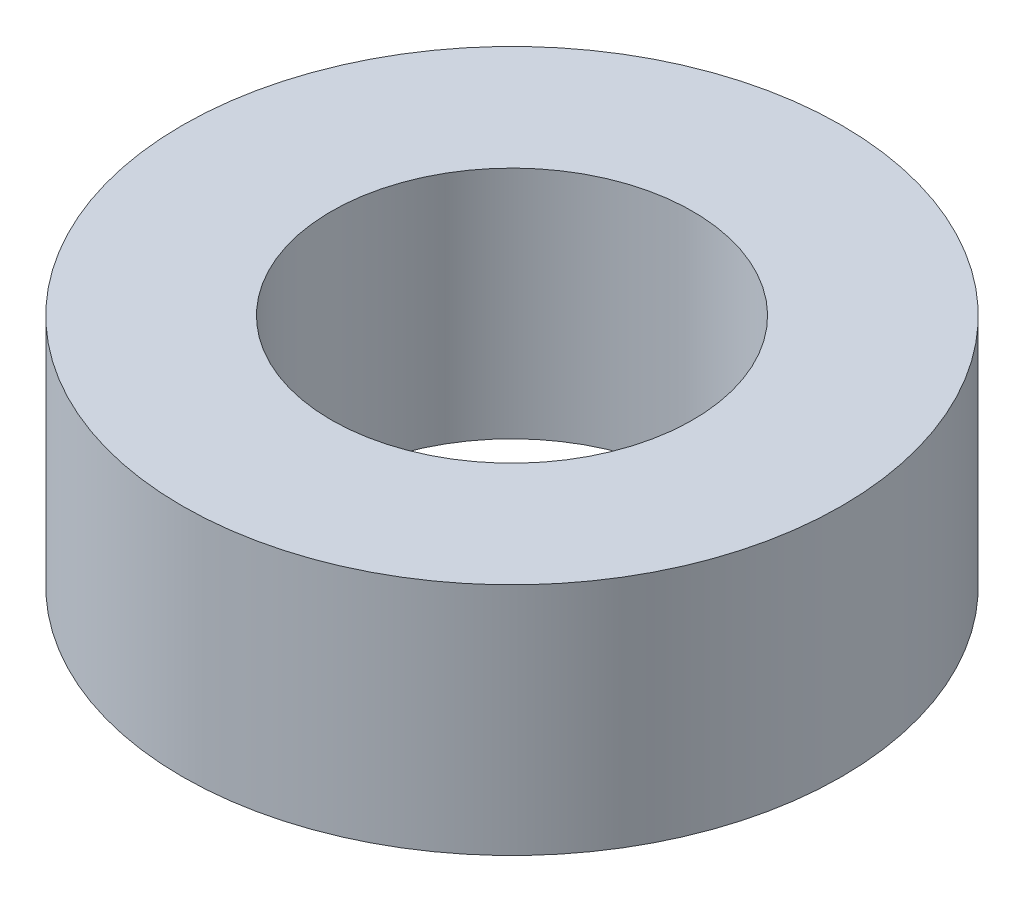
ISO-10303-21;
HEADER;
FILE_DESCRIPTION(('STEP AP214'),'2;1');
FILE_NAME('part.step','',(''),(''),'','','');
FILE_SCHEMA(('AUTOMOTIVE_DESIGN { 1 0 10303 214 1 1 1 1 }'));
ENDSEC;
DATA;
#1=APPLICATION_CONTEXT('core data for automotive mechanical design processes');
#2=APPLICATION_PROTOCOL_DEFINITION('international standard','automotive_design',2000,#1);
#3=PRODUCT_CONTEXT('',#1,'mechanical');
#4=PRODUCT('Part','Part','',(#3));
#5=PRODUCT_RELATED_PRODUCT_CATEGORY('part','',(#4));
#6=PRODUCT_DEFINITION_FORMATION('','',#4);
#7=PRODUCT_DEFINITION_CONTEXT('part definition',#1,'design');
#8=PRODUCT_DEFINITION('design','',#6,#7);
#9=PRODUCT_DEFINITION_SHAPE('','',#8);
#10=(LENGTH_UNIT() NAMED_UNIT(*) SI_UNIT(.MILLI.,.METRE.));
#11=(NAMED_UNIT(*) PLANE_ANGLE_UNIT() SI_UNIT($,.RADIAN.));
#12=(NAMED_UNIT(*) SI_UNIT($,.STERADIAN.) SOLID_ANGLE_UNIT());
#13=UNCERTAINTY_MEASURE_WITH_UNIT(LENGTH_MEASURE(1.E-05),#10,'distance_accuracy_value','');
#14=(GEOMETRIC_REPRESENTATION_CONTEXT(3) GLOBAL_UNCERTAINTY_ASSIGNED_CONTEXT((#13)) GLOBAL_UNIT_ASSIGNED_CONTEXT((#10,
#11,#12)) REPRESENTATION_CONTEXT('',''));
#15=CARTESIAN_POINT('',(0.,0.,0.));
#16=DIRECTION('',(0.,0.,1.));
#17=DIRECTION('',(1.,0.,0.));
#18=AXIS2_PLACEMENT_3D('',#15,#16,#17);
#19=CARTESIAN_POINT('',(0.,4.8,0.));
#20=DIRECTION('',(0.,1.,0.));
#21=DIRECTION('',(0.,0.,1.));
#22=AXIS2_PLACEMENT_3D('',#19,#20,#21);
#23=PLANE('',#22);
#24=CARTESIAN_POINT('',(0.,4.8,0.));
#25=DIRECTION('',(0.,1.,0.));
#26=DIRECTION('',(0.,0.,1.));
#27=AXIS2_PLACEMENT_3D('',#24,#25,#26);
#28=CIRCLE('',#27,6.75);
#29=CARTESIAN_POINT('',(0.,4.8,6.75));
#30=VERTEX_POINT('',#29);
#31=EDGE_CURVE('E10',#30,#30,#28,.T.);
#32=ORIENTED_EDGE('',*,*,#31,.T.);
#33=EDGE_LOOP('',(#32));
#34=FACE_BOUND('',#33,.T.);
#35=CARTESIAN_POINT('',(0.,4.8,0.));
#36=DIRECTION('',(0.,1.,0.));
#37=DIRECTION('',(0.,0.,1.));
#38=AXIS2_PLACEMENT_3D('',#35,#36,#37);
#39=CIRCLE('',#38,3.7);
#40=CARTESIAN_POINT('',(0.,4.8,3.7));
#41=VERTEX_POINT('',#40);
#42=EDGE_CURVE('E46',#41,#41,#39,.T.);
#43=ORIENTED_EDGE('',*,*,#42,.F.);
#44=EDGE_LOOP('',(#43));
#45=FACE_BOUND('',#44,.T.);
#46=ADVANCED_FACE('F35',(#34,#45),#23,.T.);
#47=CARTESIAN_POINT('',(0.,0.,0.));
#48=DIRECTION('',(0.,1.,0.));
#49=DIRECTION('',(0.,0.,1.));
#50=AXIS2_PLACEMENT_3D('',#47,#48,#49);
#51=PLANE('',#50);
#52=CARTESIAN_POINT('',(0.,0.,0.));
#53=DIRECTION('',(0.,1.,0.));
#54=DIRECTION('',(0.,0.,1.));
#55=AXIS2_PLACEMENT_3D('',#52,#53,#54);
#56=CIRCLE('',#55,6.75);
#57=CARTESIAN_POINT('',(0.,0.,6.75));
#58=VERTEX_POINT('',#57);
#59=EDGE_CURVE('E39',#58,#58,#56,.T.);
#60=ORIENTED_EDGE('',*,*,#59,.F.);
#61=EDGE_LOOP('',(#60));
#62=FACE_BOUND('',#61,.T.);
#63=CARTESIAN_POINT('',(0.,0.,0.));
#64=DIRECTION('',(0.,1.,0.));
#65=DIRECTION('',(0.,0.,1.));
#66=AXIS2_PLACEMENT_3D('',#63,#64,#65);
#67=CIRCLE('',#66,3.7);
#68=CARTESIAN_POINT('',(0.,0.,3.7));
#69=VERTEX_POINT('',#68);
#70=EDGE_CURVE('E48',#69,#69,#67,.T.);
#71=ORIENTED_EDGE('',*,*,#70,.T.);
#72=EDGE_LOOP('',(#71));
#73=FACE_BOUND('',#72,.T.);
#74=ADVANCED_FACE('F58',(#62,#73),#51,.F.);
#75=CARTESIAN_POINT('',(0.,4.8,0.));
#76=DIRECTION('',(0.,-1.,0.));
#77=DIRECTION('',(0.,0.,-1.));
#78=AXIS2_PLACEMENT_3D('',#75,#76,#77);
#79=CYLINDRICAL_SURFACE('',#78,6.75);
#80=ORIENTED_EDGE('',*,*,#31,.F.);
#81=EDGE_LOOP('',(#80));
#82=FACE_BOUND('',#81,.T.);
#83=ORIENTED_EDGE('',*,*,#59,.T.);
#84=EDGE_LOOP('',(#83));
#85=FACE_BOUND('',#84,.T.);
#86=ADVANCED_FACE('F37',(#82,#85),#79,.T.);
#87=CARTESIAN_POINT('',(0.,4.8,0.));
#88=DIRECTION('',(0.,-1.,0.));
#89=DIRECTION('',(0.,0.,-1.));
#90=AXIS2_PLACEMENT_3D('',#87,#88,#89);
#91=CYLINDRICAL_SURFACE('',#90,3.7);
#92=ORIENTED_EDGE('',*,*,#42,.T.);
#93=EDGE_LOOP('',(#92));
#94=FACE_BOUND('',#93,.T.);
#95=ORIENTED_EDGE('',*,*,#70,.F.);
#96=EDGE_LOOP('',(#95));
#97=FACE_BOUND('',#96,.T.);
#98=ADVANCED_FACE('F54',(#94,#97),#91,.F.);
#99=CLOSED_SHELL('',(#46,#74,#86,#98));
#100=MANIFOLD_SOLID_BREP('B2',#99);
#101=ADVANCED_BREP_SHAPE_REPRESENTATION('',(#18,#100),#14);
#102=SHAPE_DEFINITION_REPRESENTATION(#9,#101);
ENDSEC;
END-ISO-10303-21;
